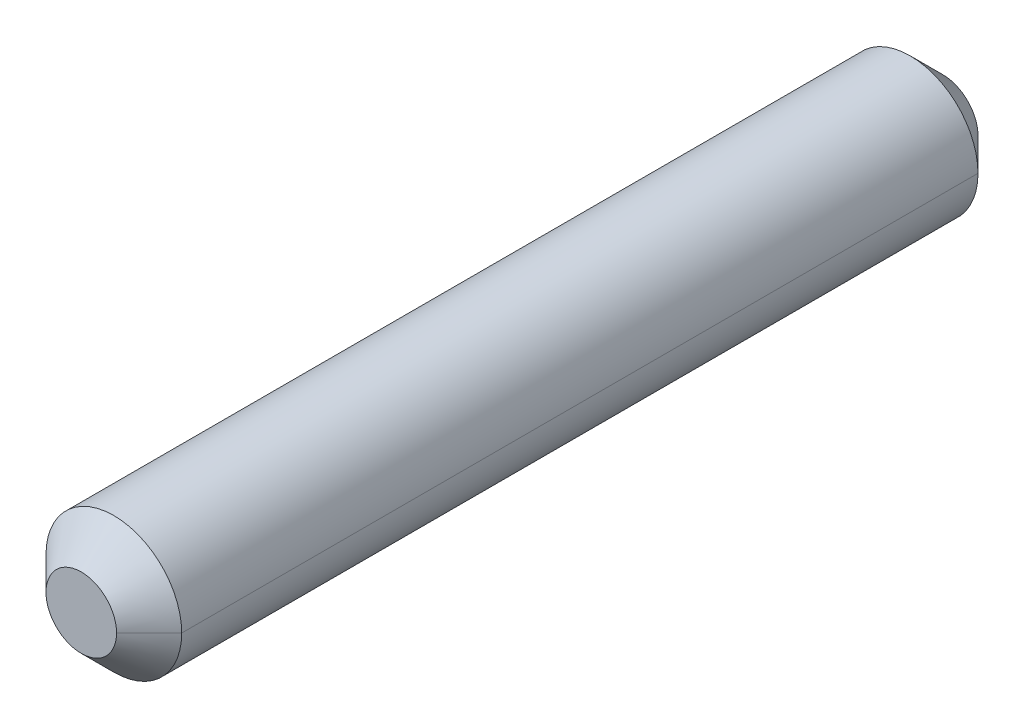
ISO-10303-21;
HEADER;
FILE_DESCRIPTION(('STEP AP214'),'2;1');
FILE_NAME('part.step','',(''),(''),'','','');
FILE_SCHEMA(('AUTOMOTIVE_DESIGN { 1 0 10303 214 1 1 1 1 }'));
ENDSEC;
DATA;
#1=APPLICATION_CONTEXT('core data for automotive mechanical design processes');
#2=APPLICATION_PROTOCOL_DEFINITION('international standard','automotive_design',2000,#1);
#3=PRODUCT_CONTEXT('',#1,'mechanical');
#4=PRODUCT('Part','Part','',(#3));
#5=PRODUCT_RELATED_PRODUCT_CATEGORY('part','',(#4));
#6=PRODUCT_DEFINITION_FORMATION('','',#4);
#7=PRODUCT_DEFINITION_CONTEXT('part definition',#1,'design');
#8=PRODUCT_DEFINITION('design','',#6,#7);
#9=PRODUCT_DEFINITION_SHAPE('','',#8);
#10=(LENGTH_UNIT() NAMED_UNIT(*) SI_UNIT(.MILLI.,.METRE.));
#11=(NAMED_UNIT(*) PLANE_ANGLE_UNIT() SI_UNIT($,.RADIAN.));
#12=(NAMED_UNIT(*) SI_UNIT($,.STERADIAN.) SOLID_ANGLE_UNIT());
#13=UNCERTAINTY_MEASURE_WITH_UNIT(LENGTH_MEASURE(1.E-05),#10,'distance_accuracy_value','');
#14=(GEOMETRIC_REPRESENTATION_CONTEXT(3) GLOBAL_UNCERTAINTY_ASSIGNED_CONTEXT((#13)) GLOBAL_UNIT_ASSIGNED_CONTEXT((#10,
#11,#12)) REPRESENTATION_CONTEXT('',''));
#15=CARTESIAN_POINT('',(0.,0.,0.));
#16=DIRECTION('',(0.,0.,1.));
#17=DIRECTION('',(1.,0.,0.));
#18=AXIS2_PLACEMENT_3D('',#15,#16,#17);
#19=CARTESIAN_POINT('',(0.,0.,7.935));
#20=DIRECTION('',(0.,0.,-1.));
#21=DIRECTION('',(-1.,0.,0.));
#22=AXIS2_PLACEMENT_3D('',#19,#20,#21);
#23=CONICAL_SURFACE('',#22,0.65,0.785398163397446);
#24=DIRECTION('',(0.707106781186546,0.,-0.707106781186549));
#25=VECTOR('',#24,1.);
#26=CARTESIAN_POINT('',(0.65,0.,7.935));
#27=LINE('',#26,#25);
#28=CARTESIAN_POINT('',(0.65,0.,7.935));
#29=VERTEX_POINT('',#28);
#30=CARTESIAN_POINT('',(1.25,0.,7.335));
#31=VERTEX_POINT('',#30);
#32=EDGE_CURVE('E77',#29,#31,#27,.T.);
#33=ORIENTED_EDGE('',*,*,#32,.F.);
#34=CARTESIAN_POINT('',(0.,0.,7.935));
#35=DIRECTION('',(0.,0.,1.));
#36=DIRECTION('',(1.,0.,0.));
#37=AXIS2_PLACEMENT_3D('',#34,#35,#36);
#38=CIRCLE('',#37,0.65);
#39=CARTESIAN_POINT('',(-0.65,0.,7.935));
#40=VERTEX_POINT('',#39);
#41=EDGE_CURVE('E26',#40,#29,#38,.T.);
#42=ORIENTED_EDGE('',*,*,#41,.F.);
#43=DIRECTION('',(-0.707106781186546,0.,-0.707106781186549));
#44=VECTOR('',#43,1.);
#45=CARTESIAN_POINT('',(-0.65,0.,7.935));
#46=LINE('',#45,#44);
#47=CARTESIAN_POINT('',(-1.25,0.,7.335));
#48=VERTEX_POINT('',#47);
#49=EDGE_CURVE('E86',#40,#48,#46,.T.);
#50=ORIENTED_EDGE('',*,*,#49,.T.);
#51=CARTESIAN_POINT('',(0.,0.,7.335));
#52=DIRECTION('',(0.,0.,-1.));
#53=DIRECTION('',(1.,0.,0.));
#54=AXIS2_PLACEMENT_3D('',#51,#52,#53);
#55=CIRCLE('',#54,1.25);
#56=EDGE_CURVE('E79',#31,#48,#55,.T.);
#57=ORIENTED_EDGE('',*,*,#56,.F.);
#58=EDGE_LOOP('',(#33,#42,#50,#57));
#59=FACE_BOUND('',#58,.T.);
#60=ADVANCED_FACE('F15',(#59),#23,.T.);
#61=CARTESIAN_POINT('',(0.,0.,-7.335));
#62=DIRECTION('',(0.,0.,1.));
#63=DIRECTION('',(1.,0.,0.));
#64=AXIS2_PLACEMENT_3D('',#61,#62,#63);
#65=CONICAL_SURFACE('',#64,1.25,0.785398163397449);
#66=DIRECTION('',(-0.707106781186548,0.,0.707106781186547));
#67=VECTOR('',#66,1.);
#68=CARTESIAN_POINT('',(-1.25,0.,-7.335));
#69=LINE('',#68,#67);
#70=CARTESIAN_POINT('',(-0.65,0.,-7.935));
#71=VERTEX_POINT('',#70);
#72=CARTESIAN_POINT('',(-1.25,0.,-7.335));
#73=VERTEX_POINT('',#72);
#74=EDGE_CURVE('E95',#71,#73,#69,.T.);
#75=ORIENTED_EDGE('',*,*,#74,.F.);
#76=CARTESIAN_POINT('',(0.,0.,-7.935));
#77=DIRECTION('',(0.,0.,-1.));
#78=DIRECTION('',(1.,0.,0.));
#79=AXIS2_PLACEMENT_3D('',#76,#77,#78);
#80=CIRCLE('',#79,0.65);
#81=CARTESIAN_POINT('',(0.65,0.,-7.935));
#82=VERTEX_POINT('',#81);
#83=EDGE_CURVE('E10',#82,#71,#80,.T.);
#84=ORIENTED_EDGE('',*,*,#83,.F.);
#85=DIRECTION('',(0.707106781186548,0.,0.707106781186547));
#86=VECTOR('',#85,1.);
#87=CARTESIAN_POINT('',(1.25,0.,-7.335));
#88=LINE('',#87,#86);
#89=CARTESIAN_POINT('',(1.25,0.,-7.335));
#90=VERTEX_POINT('',#89);
#91=EDGE_CURVE('E115',#82,#90,#88,.T.);
#92=ORIENTED_EDGE('',*,*,#91,.T.);
#93=CARTESIAN_POINT('',(0.,0.,-7.335));
#94=DIRECTION('',(0.,0.,1.));
#95=DIRECTION('',(1.,0.,0.));
#96=AXIS2_PLACEMENT_3D('',#93,#94,#95);
#97=CIRCLE('',#96,1.25);
#98=EDGE_CURVE('E40',#73,#90,#97,.T.);
#99=ORIENTED_EDGE('',*,*,#98,.F.);
#100=EDGE_LOOP('',(#75,#84,#92,#99));
#101=FACE_BOUND('',#100,.T.);
#102=ADVANCED_FACE('F184',(#101),#65,.T.);
#103=CARTESIAN_POINT('',(0.,0.,-7.935));
#104=DIRECTION('',(0.,0.,1.));
#105=DIRECTION('',(1.,0.,0.));
#106=AXIS2_PLACEMENT_3D('',#103,#104,#105);
#107=PLANE('',#106);
#108=ORIENTED_EDGE('',*,*,#83,.T.);
#109=CARTESIAN_POINT('',(0.,0.,-7.935));
#110=DIRECTION('',(0.,0.,-1.));
#111=DIRECTION('',(1.,0.,0.));
#112=AXIS2_PLACEMENT_3D('',#109,#110,#111);
#113=CIRCLE('',#112,0.65);
#114=EDGE_CURVE('E94',#71,#82,#113,.T.);
#115=ORIENTED_EDGE('',*,*,#114,.T.);
#116=EDGE_LOOP('',(#108,#115));
#117=FACE_BOUND('',#116,.T.);
#118=ADVANCED_FACE('F189',(#117),#107,.F.);
#119=CARTESIAN_POINT('',(0.,0.,7.935));
#120=DIRECTION('',(0.,0.,1.));
#121=DIRECTION('',(1.,0.,0.));
#122=AXIS2_PLACEMENT_3D('',#119,#120,#121);
#123=PLANE('',#122);
#124=ORIENTED_EDGE('',*,*,#41,.T.);
#125=CARTESIAN_POINT('',(0.,0.,7.935));
#126=DIRECTION('',(0.,0.,1.));
#127=DIRECTION('',(1.,0.,0.));
#128=AXIS2_PLACEMENT_3D('',#125,#126,#127);
#129=CIRCLE('',#128,0.65);
#130=EDGE_CURVE('E70',#29,#40,#129,.T.);
#131=ORIENTED_EDGE('',*,*,#130,.T.);
#132=EDGE_LOOP('',(#124,#131));
#133=FACE_BOUND('',#132,.T.);
#134=ADVANCED_FACE('F68',(#133),#123,.T.);
#135=CARTESIAN_POINT('',(0.,0.,7.935));
#136=DIRECTION('',(0.,0.,-1.));
#137=DIRECTION('',(-1.,0.,0.));
#138=AXIS2_PLACEMENT_3D('',#135,#136,#137);
#139=CYLINDRICAL_SURFACE('',#138,1.25);
#140=DIRECTION('',(0.,0.,-1.));
#141=VECTOR('',#140,1.);
#142=CARTESIAN_POINT('',(1.25,0.,7.935));
#143=LINE('',#142,#141);
#144=EDGE_CURVE('E112',#31,#90,#143,.T.);
#145=ORIENTED_EDGE('',*,*,#144,.F.);
#146=ORIENTED_EDGE('',*,*,#56,.T.);
#147=DIRECTION('',(0.,0.,-1.));
#148=VECTOR('',#147,1.);
#149=CARTESIAN_POINT('',(-1.25,0.,7.935));
#150=LINE('',#149,#148);
#151=EDGE_CURVE('E19',#48,#73,#150,.T.);
#152=ORIENTED_EDGE('',*,*,#151,.T.);
#153=ORIENTED_EDGE('',*,*,#98,.T.);
#154=EDGE_LOOP('',(#145,#146,#152,#153));
#155=FACE_BOUND('',#154,.T.);
#156=ADVANCED_FACE('F216',(#155),#139,.T.);
#157=CARTESIAN_POINT('',(0.,0.,7.935));
#158=DIRECTION('',(0.,0.,-1.));
#159=DIRECTION('',(-1.,0.,0.));
#160=AXIS2_PLACEMENT_3D('',#157,#158,#159);
#161=CYLINDRICAL_SURFACE('',#160,1.25);
#162=CARTESIAN_POINT('',(0.,0.,7.335));
#163=DIRECTION('',(0.,0.,-1.));
#164=DIRECTION('',(1.,0.,0.));
#165=AXIS2_PLACEMENT_3D('',#162,#163,#164);
#166=CIRCLE('',#165,1.25);
#167=EDGE_CURVE('E83',#48,#31,#166,.T.);
#168=ORIENTED_EDGE('',*,*,#167,.T.);
#169=ORIENTED_EDGE('',*,*,#144,.T.);
#170=CARTESIAN_POINT('',(0.,0.,-7.335));
#171=DIRECTION('',(0.,0.,1.));
#172=DIRECTION('',(1.,0.,0.));
#173=AXIS2_PLACEMENT_3D('',#170,#171,#172);
#174=CIRCLE('',#173,1.25);
#175=EDGE_CURVE('E98',#90,#73,#174,.T.);
#176=ORIENTED_EDGE('',*,*,#175,.T.);
#177=ORIENTED_EDGE('',*,*,#151,.F.);
#178=EDGE_LOOP('',(#168,#169,#176,#177));
#179=FACE_BOUND('',#178,.T.);
#180=ADVANCED_FACE('F17',(#179),#161,.T.);
#181=CARTESIAN_POINT('',(0.,0.,-7.335));
#182=DIRECTION('',(0.,0.,1.));
#183=DIRECTION('',(1.,0.,0.));
#184=AXIS2_PLACEMENT_3D('',#181,#182,#183);
#185=CONICAL_SURFACE('',#184,1.25,0.785398163397449);
#186=ORIENTED_EDGE('',*,*,#114,.F.);
#187=ORIENTED_EDGE('',*,*,#74,.T.);
#188=ORIENTED_EDGE('',*,*,#175,.F.);
#189=ORIENTED_EDGE('',*,*,#91,.F.);
#190=EDGE_LOOP('',(#186,#187,#188,#189));
#191=FACE_BOUND('',#190,.T.);
#192=ADVANCED_FACE('F209',(#191),#185,.T.);
#193=CARTESIAN_POINT('',(0.,0.,7.935));
#194=DIRECTION('',(0.,0.,-1.));
#195=DIRECTION('',(-1.,0.,0.));
#196=AXIS2_PLACEMENT_3D('',#193,#194,#195);
#197=CONICAL_SURFACE('',#196,0.65,0.785398163397446);
#198=ORIENTED_EDGE('',*,*,#130,.F.);
#199=ORIENTED_EDGE('',*,*,#32,.T.);
#200=ORIENTED_EDGE('',*,*,#167,.F.);
#201=ORIENTED_EDGE('',*,*,#49,.F.);
#202=EDGE_LOOP('',(#198,#199,#200,#201));
#203=FACE_BOUND('',#202,.T.);
#204=ADVANCED_FACE('F85',(#203),#197,.T.);
#205=CLOSED_SHELL('',(#60,#102,#118,#134,#156,#180,#192,#204));
#206=MANIFOLD_SOLID_BREP('B1',#205);
#207=ADVANCED_BREP_SHAPE_REPRESENTATION('',(#18,#206),#14);
#208=SHAPE_DEFINITION_REPRESENTATION(#9,#207);
ENDSEC;
END-ISO-10303-21;
